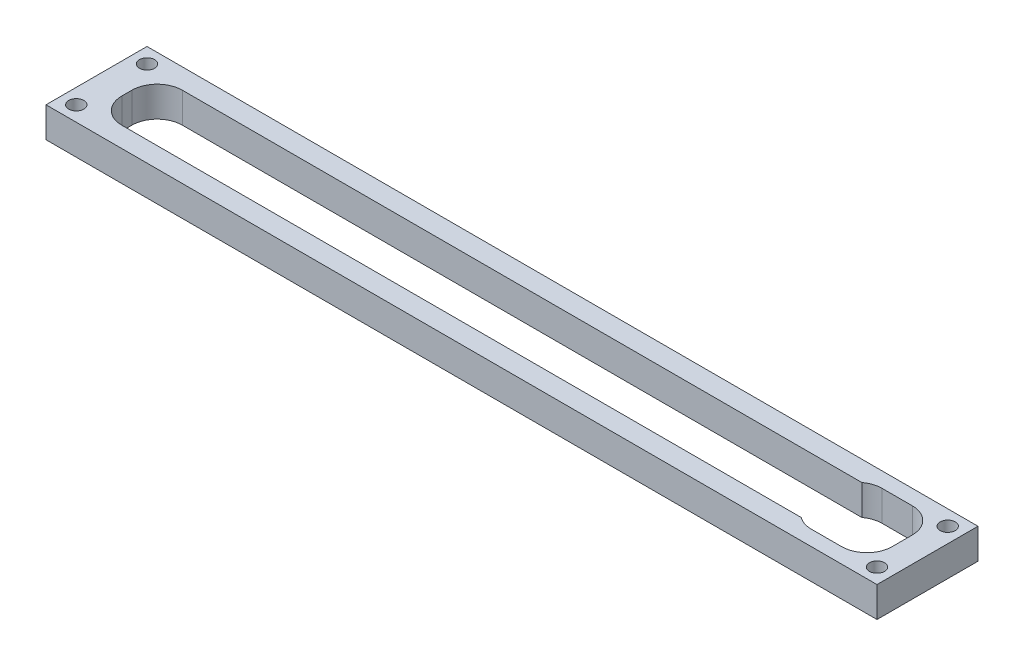
ISO-10303-21;
HEADER;
FILE_DESCRIPTION(('STEP AP214'),'2;1');
FILE_NAME('part.step','',(''),(''),'','','');
FILE_SCHEMA(('AUTOMOTIVE_DESIGN { 1 0 10303 214 1 1 1 1 }'));
ENDSEC;
DATA;
#1=APPLICATION_CONTEXT('core data for automotive mechanical design processes');
#2=APPLICATION_PROTOCOL_DEFINITION('international standard','automotive_design',2000,#1);
#3=PRODUCT_CONTEXT('',#1,'mechanical');
#4=PRODUCT('Part','Part','',(#3));
#5=PRODUCT_RELATED_PRODUCT_CATEGORY('part','',(#4));
#6=PRODUCT_DEFINITION_FORMATION('','',#4);
#7=PRODUCT_DEFINITION_CONTEXT('part definition',#1,'design');
#8=PRODUCT_DEFINITION('design','',#6,#7);
#9=PRODUCT_DEFINITION_SHAPE('','',#8);
#10=(LENGTH_UNIT() NAMED_UNIT(*) SI_UNIT(.MILLI.,.METRE.));
#11=(NAMED_UNIT(*) PLANE_ANGLE_UNIT() SI_UNIT($,.RADIAN.));
#12=(NAMED_UNIT(*) SI_UNIT($,.STERADIAN.) SOLID_ANGLE_UNIT());
#13=UNCERTAINTY_MEASURE_WITH_UNIT(LENGTH_MEASURE(1.E-05),#10,'distance_accuracy_value','');
#14=(GEOMETRIC_REPRESENTATION_CONTEXT(3) GLOBAL_UNCERTAINTY_ASSIGNED_CONTEXT((#13)) GLOBAL_UNIT_ASSIGNED_CONTEXT((#10,
#11,#12)) REPRESENTATION_CONTEXT('',''));
#15=CARTESIAN_POINT('',(0.,0.,0.));
#16=DIRECTION('',(0.,0.,1.));
#17=DIRECTION('',(1.,0.,0.));
#18=AXIS2_PLACEMENT_3D('',#15,#16,#17);
#19=CARTESIAN_POINT('',(0.,6.,0.));
#20=DIRECTION('',(0.,-1.,0.));
#21=DIRECTION('',(0.,0.,-1.));
#22=AXIS2_PLACEMENT_3D('',#19,#20,#21);
#23=PLANE('',#22);
#24=DIRECTION('',(0.,0.,1.));
#25=VECTOR('',#24,1.);
#26=CARTESIAN_POINT('',(0.,6.,0.));
#27=LINE('',#26,#25);
#28=CARTESIAN_POINT('',(0.,6.,-20.));
#29=VERTEX_POINT('',#28);
#30=CARTESIAN_POINT('',(0.,6.,0.));
#31=VERTEX_POINT('',#30);
#32=EDGE_CURVE('E250',#29,#31,#27,.T.);
#33=ORIENTED_EDGE('',*,*,#32,.T.);
#34=DIRECTION('',(1.,0.,0.));
#35=VECTOR('',#34,1.);
#36=CARTESIAN_POINT('',(0.,6.,0.));
#37=LINE('',#36,#35);
#38=CARTESIAN_POINT('',(164.534777256069,6.,0.));
#39=VERTEX_POINT('',#38);
#40=EDGE_CURVE('E253',#31,#39,#37,.T.);
#41=ORIENTED_EDGE('',*,*,#40,.T.);
#42=DIRECTION('',(0.,0.,-1.));
#43=VECTOR('',#42,1.);
#44=CARTESIAN_POINT('',(164.534777256069,6.,0.));
#45=LINE('',#44,#43);
#46=CARTESIAN_POINT('',(164.534777256069,6.,-20.));
#47=VERTEX_POINT('',#46);
#48=EDGE_CURVE('E256',#39,#47,#45,.T.);
#49=ORIENTED_EDGE('',*,*,#48,.T.);
#50=DIRECTION('',(-1.,0.,0.));
#51=VECTOR('',#50,1.);
#52=CARTESIAN_POINT('',(0.,6.,-20.));
#53=LINE('',#52,#51);
#54=EDGE_CURVE('E258',#47,#29,#53,.T.);
#55=ORIENTED_EDGE('',*,*,#54,.T.);
#56=EDGE_LOOP('',(#33,#41,#49,#55));
#57=FACE_BOUND('',#56,.T.);
#58=DIRECTION('',(-1.,0.,0.));
#59=VECTOR('',#58,1.);
#60=CARTESIAN_POINT('',(5.99999999999999,6.,-16.));
#61=LINE('',#60,#59);
#62=CARTESIAN_POINT('',(145.534777256069,6.,-16.));
#63=VERTEX_POINT('',#62);
#64=CARTESIAN_POINT('',(11.,6.,-16.));
#65=VERTEX_POINT('',#64);
#66=EDGE_CURVE('E243',#63,#65,#61,.T.);
#67=ORIENTED_EDGE('',*,*,#66,.F.);
#68=CARTESIAN_POINT('',(148.534777256069,6.,-12.));
#69=DIRECTION('',(0.,-1.,0.));
#70=DIRECTION('',(0.,0.,-1.));
#71=AXIS2_PLACEMENT_3D('',#68,#69,#70);
#72=CIRCLE('',#71,5.);
#73=CARTESIAN_POINT('',(148.534777256069,6.,-17.));
#74=VERTEX_POINT('',#73);
#75=EDGE_CURVE('E193',#63,#74,#72,.T.);
#76=ORIENTED_EDGE('',*,*,#75,.T.);
#77=DIRECTION('',(-1.,0.,0.));
#78=VECTOR('',#77,1.);
#79=CARTESIAN_POINT('',(145.534777256069,6.,-17.));
#80=LINE('',#79,#78);
#81=CARTESIAN_POINT('',(154.534777256069,6.,-17.));
#82=VERTEX_POINT('',#81);
#83=EDGE_CURVE('E205',#82,#74,#80,.T.);
#84=ORIENTED_EDGE('',*,*,#83,.F.);
#85=CARTESIAN_POINT('',(154.534777256069,6.,-12.));
#86=DIRECTION('',(0.,-1.,0.));
#87=DIRECTION('',(0.,0.,-1.));
#88=AXIS2_PLACEMENT_3D('',#85,#86,#87);
#89=CIRCLE('',#88,5.);
#90=CARTESIAN_POINT('',(159.534777256069,6.,-12.));
#91=VERTEX_POINT('',#90);
#92=EDGE_CURVE('E185',#82,#91,#89,.T.);
#93=ORIENTED_EDGE('',*,*,#92,.T.);
#94=DIRECTION('',(0.,0.,-1.));
#95=VECTOR('',#94,1.);
#96=CARTESIAN_POINT('',(159.534777256069,6.,-17.));
#97=LINE('',#96,#95);
#98=CARTESIAN_POINT('',(159.534777256069,6.,-8.00000000000001));
#99=VERTEX_POINT('',#98);
#100=EDGE_CURVE('E202',#99,#91,#97,.T.);
#101=ORIENTED_EDGE('',*,*,#100,.F.);
#102=CARTESIAN_POINT('',(154.534777256069,6.,-8.00000000000001));
#103=DIRECTION('',(0.,-1.,0.));
#104=DIRECTION('',(0.,0.,-1.));
#105=AXIS2_PLACEMENT_3D('',#102,#103,#104);
#106=CIRCLE('',#105,5.);
#107=CARTESIAN_POINT('',(154.534777256069,6.,-3.00000000000001));
#108=VERTEX_POINT('',#107);
#109=EDGE_CURVE('E189',#99,#108,#106,.T.);
#110=ORIENTED_EDGE('',*,*,#109,.T.);
#111=DIRECTION('',(1.,0.,0.));
#112=VECTOR('',#111,1.);
#113=CARTESIAN_POINT('',(145.534777256069,6.,-3.00000000000001));
#114=LINE('',#113,#112);
#115=CARTESIAN_POINT('',(148.534777256069,6.,-3.00000000000001));
#116=VERTEX_POINT('',#115);
#117=EDGE_CURVE('E200',#116,#108,#114,.T.);
#118=ORIENTED_EDGE('',*,*,#117,.F.);
#119=CARTESIAN_POINT('',(148.534777256069,6.,-8.00000000000001));
#120=DIRECTION('',(0.,-1.,0.));
#121=DIRECTION('',(0.,0.,-1.));
#122=AXIS2_PLACEMENT_3D('',#119,#120,#121);
#123=CIRCLE('',#122,5.);
#124=CARTESIAN_POINT('',(145.534777256069,6.,-4.00000000000002));
#125=VERTEX_POINT('',#124);
#126=EDGE_CURVE('E43',#116,#125,#123,.T.);
#127=ORIENTED_EDGE('',*,*,#126,.T.);
#128=DIRECTION('',(1.,0.,0.));
#129=VECTOR('',#128,1.);
#130=CARTESIAN_POINT('',(5.99999999999999,6.,-4.00000000000002));
#131=LINE('',#130,#129);
#132=CARTESIAN_POINT('',(11.,6.,-4.00000000000002));
#133=VERTEX_POINT('',#132);
#134=EDGE_CURVE('E162',#133,#125,#131,.T.);
#135=ORIENTED_EDGE('',*,*,#134,.F.);
#136=CARTESIAN_POINT('',(11.,6.,-9.00000000000001));
#137=DIRECTION('',(0.,-1.,0.));
#138=DIRECTION('',(0.,0.,-1.));
#139=AXIS2_PLACEMENT_3D('',#136,#137,#138);
#140=CIRCLE('',#139,5.);
#141=CARTESIAN_POINT('',(5.99999999999999,6.,-9.00000000000001));
#142=VERTEX_POINT('',#141);
#143=EDGE_CURVE('E179',#133,#142,#140,.T.);
#144=ORIENTED_EDGE('',*,*,#143,.T.);
#145=DIRECTION('',(0.,0.,1.));
#146=VECTOR('',#145,1.);
#147=CARTESIAN_POINT('',(5.99999999999999,6.,-16.));
#148=LINE('',#147,#146);
#149=CARTESIAN_POINT('',(5.99999999999999,6.,-11.));
#150=VERTEX_POINT('',#149);
#151=EDGE_CURVE('E239',#150,#142,#148,.T.);
#152=ORIENTED_EDGE('',*,*,#151,.F.);
#153=CARTESIAN_POINT('',(11.,6.,-11.));
#154=DIRECTION('',(0.,-1.,0.));
#155=DIRECTION('',(0.,0.,-1.));
#156=AXIS2_PLACEMENT_3D('',#153,#154,#155);
#157=CIRCLE('',#156,5.);
#158=EDGE_CURVE('E183',#150,#65,#157,.T.);
#159=ORIENTED_EDGE('',*,*,#158,.T.);
#160=EDGE_LOOP('',(#67,#76,#84,#93,#101,#110,#118,#127,#135,#144,#152,#159));
#161=FACE_BOUND('',#160,.T.);
#162=CARTESIAN_POINT('',(3.,6.,-17.));
#163=DIRECTION('',(0.,1.,0.));
#164=DIRECTION('',(0.,0.,1.));
#165=AXIS2_PLACEMENT_3D('',#162,#163,#164);
#166=CIRCLE('',#165,1.5);
#167=CARTESIAN_POINT('',(3.,6.,-15.5));
#168=VERTEX_POINT('',#167);
#169=EDGE_CURVE('E234',#168,#168,#166,.T.);
#170=ORIENTED_EDGE('',*,*,#169,.F.);
#171=EDGE_LOOP('',(#170));
#172=FACE_BOUND('',#171,.T.);
#173=CARTESIAN_POINT('',(3.,6.,-3.));
#174=DIRECTION('',(0.,1.,0.));
#175=DIRECTION('',(0.,0.,-1.));
#176=AXIS2_PLACEMENT_3D('',#173,#174,#175);
#177=CIRCLE('',#176,1.5);
#178=CARTESIAN_POINT('',(3.,6.,-4.5));
#179=VERTEX_POINT('',#178);
#180=EDGE_CURVE('E228',#179,#179,#177,.T.);
#181=ORIENTED_EDGE('',*,*,#180,.F.);
#182=EDGE_LOOP('',(#181));
#183=FACE_BOUND('',#182,.T.);
#184=CARTESIAN_POINT('',(161.534777256069,6.,-3.00000000000002));
#185=DIRECTION('',(0.,1.,0.));
#186=DIRECTION('',(0.,0.,1.));
#187=AXIS2_PLACEMENT_3D('',#184,#185,#186);
#188=CIRCLE('',#187,1.5);
#189=CARTESIAN_POINT('',(161.534777256069,6.,-1.50000000000002));
#190=VERTEX_POINT('',#189);
#191=EDGE_CURVE('E222',#190,#190,#188,.T.);
#192=ORIENTED_EDGE('',*,*,#191,.F.);
#193=EDGE_LOOP('',(#192));
#194=FACE_BOUND('',#193,.T.);
#195=CARTESIAN_POINT('',(161.534777256069,6.,-17.0000000000001));
#196=DIRECTION('',(0.,1.,0.));
#197=DIRECTION('',(0.,0.,-1.));
#198=AXIS2_PLACEMENT_3D('',#195,#196,#197);
#199=CIRCLE('',#198,1.5);
#200=CARTESIAN_POINT('',(161.534777256069,6.,-18.5000000000001));
#201=VERTEX_POINT('',#200);
#202=EDGE_CURVE('E216',#201,#201,#199,.T.);
#203=ORIENTED_EDGE('',*,*,#202,.F.);
#204=EDGE_LOOP('',(#203));
#205=FACE_BOUND('',#204,.T.);
#206=ADVANCED_FACE('F35',(#57,#161,#172,#183,#194,#205),#23,.F.);
#207=CARTESIAN_POINT('',(0.,0.,0.));
#208=DIRECTION('',(0.,-1.,0.));
#209=DIRECTION('',(0.,0.,-1.));
#210=AXIS2_PLACEMENT_3D('',#207,#208,#209);
#211=PLANE('',#210);
#212=DIRECTION('',(-1.,0.,0.));
#213=VECTOR('',#212,1.);
#214=CARTESIAN_POINT('',(145.534777256069,0.,-17.));
#215=LINE('',#214,#213);
#216=CARTESIAN_POINT('',(154.534777256069,0.,-17.));
#217=VERTEX_POINT('',#216);
#218=CARTESIAN_POINT('',(148.534777256069,0.,-17.));
#219=VERTEX_POINT('',#218);
#220=EDGE_CURVE('E165',#217,#219,#215,.T.);
#221=ORIENTED_EDGE('',*,*,#220,.T.);
#222=CARTESIAN_POINT('',(148.534777256069,0.,-12.));
#223=DIRECTION('',(0.,-1.,0.));
#224=DIRECTION('',(0.,0.,-1.));
#225=AXIS2_PLACEMENT_3D('',#222,#223,#224);
#226=CIRCLE('',#225,5.);
#227=CARTESIAN_POINT('',(145.534777256069,0.,-16.));
#228=VERTEX_POINT('',#227);
#229=EDGE_CURVE('E195',#219,#228,#226,.F.);
#230=ORIENTED_EDGE('',*,*,#229,.T.);
#231=DIRECTION('',(-1.,0.,0.));
#232=VECTOR('',#231,1.);
#233=CARTESIAN_POINT('',(5.99999999999999,0.,-16.));
#234=LINE('',#233,#232);
#235=CARTESIAN_POINT('',(11.,0.,-16.));
#236=VERTEX_POINT('',#235);
#237=EDGE_CURVE('E154',#228,#236,#234,.T.);
#238=ORIENTED_EDGE('',*,*,#237,.T.);
#239=CARTESIAN_POINT('',(11.,0.,-11.));
#240=DIRECTION('',(0.,-1.,0.));
#241=DIRECTION('',(0.,0.,-1.));
#242=AXIS2_PLACEMENT_3D('',#239,#240,#241);
#243=CIRCLE('',#242,5.);
#244=CARTESIAN_POINT('',(5.99999999999999,0.,-11.));
#245=VERTEX_POINT('',#244);
#246=EDGE_CURVE('E181',#236,#245,#243,.F.);
#247=ORIENTED_EDGE('',*,*,#246,.T.);
#248=DIRECTION('',(0.,0.,1.));
#249=VECTOR('',#248,1.);
#250=CARTESIAN_POINT('',(5.99999999999999,0.,-16.));
#251=LINE('',#250,#249);
#252=CARTESIAN_POINT('',(5.99999999999999,0.,-9.00000000000001));
#253=VERTEX_POINT('',#252);
#254=EDGE_CURVE('E155',#245,#253,#251,.T.);
#255=ORIENTED_EDGE('',*,*,#254,.T.);
#256=CARTESIAN_POINT('',(11.,0.,-9.00000000000001));
#257=DIRECTION('',(0.,-1.,0.));
#258=DIRECTION('',(0.,0.,-1.));
#259=AXIS2_PLACEMENT_3D('',#256,#257,#258);
#260=CIRCLE('',#259,5.);
#261=CARTESIAN_POINT('',(11.,0.,-4.00000000000002));
#262=VERTEX_POINT('',#261);
#263=EDGE_CURVE('E151',#253,#262,#260,.F.);
#264=ORIENTED_EDGE('',*,*,#263,.T.);
#265=DIRECTION('',(1.,0.,0.));
#266=VECTOR('',#265,1.);
#267=CARTESIAN_POINT('',(5.99999999999999,0.,-4.00000000000002));
#268=LINE('',#267,#266);
#269=CARTESIAN_POINT('',(145.534777256069,0.,-4.00000000000002));
#270=VERTEX_POINT('',#269);
#271=EDGE_CURVE('E145',#262,#270,#268,.T.);
#272=ORIENTED_EDGE('',*,*,#271,.T.);
#273=CARTESIAN_POINT('',(148.534777256069,0.,-8.00000000000001));
#274=DIRECTION('',(0.,-1.,0.));
#275=DIRECTION('',(0.,0.,-1.));
#276=AXIS2_PLACEMENT_3D('',#273,#274,#275);
#277=CIRCLE('',#276,5.);
#278=CARTESIAN_POINT('',(148.534777256069,0.,-3.00000000000001));
#279=VERTEX_POINT('',#278);
#280=EDGE_CURVE('E11',#270,#279,#277,.F.);
#281=ORIENTED_EDGE('',*,*,#280,.T.);
#282=DIRECTION('',(1.,0.,0.));
#283=VECTOR('',#282,1.);
#284=CARTESIAN_POINT('',(145.534777256069,0.,-3.00000000000001));
#285=LINE('',#284,#283);
#286=CARTESIAN_POINT('',(154.534777256069,0.,-3.00000000000001));
#287=VERTEX_POINT('',#286);
#288=EDGE_CURVE('E212',#279,#287,#285,.T.);
#289=ORIENTED_EDGE('',*,*,#288,.T.);
#290=CARTESIAN_POINT('',(154.534777256069,0.,-8.00000000000001));
#291=DIRECTION('',(0.,-1.,0.));
#292=DIRECTION('',(0.,0.,-1.));
#293=AXIS2_PLACEMENT_3D('',#290,#291,#292);
#294=CIRCLE('',#293,5.);
#295=CARTESIAN_POINT('',(159.534777256069,0.,-8.00000000000001));
#296=VERTEX_POINT('',#295);
#297=EDGE_CURVE('E191',#287,#296,#294,.F.);
#298=ORIENTED_EDGE('',*,*,#297,.T.);
#299=DIRECTION('',(0.,0.,-1.));
#300=VECTOR('',#299,1.);
#301=CARTESIAN_POINT('',(159.534777256069,0.,-17.));
#302=LINE('',#301,#300);
#303=CARTESIAN_POINT('',(159.534777256069,0.,-12.));
#304=VERTEX_POINT('',#303);
#305=EDGE_CURVE('E300',#296,#304,#302,.T.);
#306=ORIENTED_EDGE('',*,*,#305,.T.);
#307=CARTESIAN_POINT('',(154.534777256069,0.,-12.));
#308=DIRECTION('',(0.,-1.,0.));
#309=DIRECTION('',(0.,0.,-1.));
#310=AXIS2_PLACEMENT_3D('',#307,#308,#309);
#311=CIRCLE('',#310,5.);
#312=EDGE_CURVE('E187',#304,#217,#311,.F.);
#313=ORIENTED_EDGE('',*,*,#312,.T.);
#314=EDGE_LOOP('',(#221,#230,#238,#247,#255,#264,#272,#281,#289,#298,#306,#313));
#315=FACE_BOUND('',#314,.T.);
#316=CARTESIAN_POINT('',(161.534777256069,0.,-3.00000000000002));
#317=DIRECTION('',(0.,1.,0.));
#318=DIRECTION('',(0.,0.,1.));
#319=AXIS2_PLACEMENT_3D('',#316,#317,#318);
#320=CIRCLE('',#319,1.5);
#321=CARTESIAN_POINT('',(161.534777256069,0.,-1.50000000000002));
#322=VERTEX_POINT('',#321);
#323=EDGE_CURVE('E219',#322,#322,#320,.T.);
#324=ORIENTED_EDGE('',*,*,#323,.T.);
#325=EDGE_LOOP('',(#324));
#326=FACE_BOUND('',#325,.T.);
#327=CARTESIAN_POINT('',(3.,0.,-17.));
#328=DIRECTION('',(0.,1.,0.));
#329=DIRECTION('',(0.,0.,1.));
#330=AXIS2_PLACEMENT_3D('',#327,#328,#329);
#331=CIRCLE('',#330,1.5);
#332=CARTESIAN_POINT('',(3.,0.,-15.5));
#333=VERTEX_POINT('',#332);
#334=EDGE_CURVE('E231',#333,#333,#331,.T.);
#335=ORIENTED_EDGE('',*,*,#334,.T.);
#336=EDGE_LOOP('',(#335));
#337=FACE_BOUND('',#336,.T.);
#338=DIRECTION('',(0.,0.,1.));
#339=VECTOR('',#338,1.);
#340=CARTESIAN_POINT('',(0.,0.,0.));
#341=LINE('',#340,#339);
#342=CARTESIAN_POINT('',(0.,0.,-20.));
#343=VERTEX_POINT('',#342);
#344=CARTESIAN_POINT('',(0.,0.,0.));
#345=VERTEX_POINT('',#344);
#346=EDGE_CURVE('E246',#343,#345,#341,.T.);
#347=ORIENTED_EDGE('',*,*,#346,.F.);
#348=DIRECTION('',(-1.,0.,0.));
#349=VECTOR('',#348,1.);
#350=CARTESIAN_POINT('',(0.,0.,-20.));
#351=LINE('',#350,#349);
#352=CARTESIAN_POINT('',(164.534777256069,0.,-20.));
#353=VERTEX_POINT('',#352);
#354=EDGE_CURVE('E254',#353,#343,#351,.T.);
#355=ORIENTED_EDGE('',*,*,#354,.F.);
#356=DIRECTION('',(0.,0.,-1.));
#357=VECTOR('',#356,1.);
#358=CARTESIAN_POINT('',(164.534777256069,0.,0.));
#359=LINE('',#358,#357);
#360=CARTESIAN_POINT('',(164.534777256069,0.,0.));
#361=VERTEX_POINT('',#360);
#362=EDGE_CURVE('E265',#361,#353,#359,.T.);
#363=ORIENTED_EDGE('',*,*,#362,.F.);
#364=DIRECTION('',(1.,0.,0.));
#365=VECTOR('',#364,1.);
#366=CARTESIAN_POINT('',(0.,0.,0.));
#367=LINE('',#366,#365);
#368=EDGE_CURVE('E263',#345,#361,#367,.T.);
#369=ORIENTED_EDGE('',*,*,#368,.F.);
#370=EDGE_LOOP('',(#347,#355,#363,#369));
#371=FACE_BOUND('',#370,.T.);
#372=CARTESIAN_POINT('',(3.,0.,-3.));
#373=DIRECTION('',(0.,1.,0.));
#374=DIRECTION('',(0.,0.,-1.));
#375=AXIS2_PLACEMENT_3D('',#372,#373,#374);
#376=CIRCLE('',#375,1.5);
#377=CARTESIAN_POINT('',(3.,0.,-4.5));
#378=VERTEX_POINT('',#377);
#379=EDGE_CURVE('E225',#378,#378,#376,.T.);
#380=ORIENTED_EDGE('',*,*,#379,.T.);
#381=EDGE_LOOP('',(#380));
#382=FACE_BOUND('',#381,.T.);
#383=CARTESIAN_POINT('',(161.534777256069,0.,-17.0000000000001));
#384=DIRECTION('',(0.,1.,0.));
#385=DIRECTION('',(0.,0.,-1.));
#386=AXIS2_PLACEMENT_3D('',#383,#384,#385);
#387=CIRCLE('',#386,1.5);
#388=CARTESIAN_POINT('',(161.534777256069,0.,-18.5000000000001));
#389=VERTEX_POINT('',#388);
#390=EDGE_CURVE('E214',#389,#389,#387,.T.);
#391=ORIENTED_EDGE('',*,*,#390,.T.);
#392=EDGE_LOOP('',(#391));
#393=FACE_BOUND('',#392,.T.);
#394=ADVANCED_FACE('F148',(#315,#326,#337,#371,#382,#393),#211,.T.);
#395=CARTESIAN_POINT('',(0.,6.,0.));
#396=DIRECTION('',(1.,0.,0.));
#397=DIRECTION('',(0.,0.,-1.));
#398=AXIS2_PLACEMENT_3D('',#395,#396,#397);
#399=PLANE('',#398);
#400=ORIENTED_EDGE('',*,*,#346,.T.);
#401=DIRECTION('',(0.,-1.,0.));
#402=VECTOR('',#401,1.);
#403=CARTESIAN_POINT('',(0.,6.,0.));
#404=LINE('',#403,#402);
#405=EDGE_CURVE('E276',#31,#345,#404,.T.);
#406=ORIENTED_EDGE('',*,*,#405,.F.);
#407=ORIENTED_EDGE('',*,*,#32,.F.);
#408=DIRECTION('',(0.,-1.,0.));
#409=VECTOR('',#408,1.);
#410=CARTESIAN_POINT('',(0.,6.,-20.));
#411=LINE('',#410,#409);
#412=EDGE_CURVE('E260',#29,#343,#411,.T.);
#413=ORIENTED_EDGE('',*,*,#412,.T.);
#414=EDGE_LOOP('',(#400,#406,#407,#413));
#415=FACE_BOUND('',#414,.T.);
#416=ADVANCED_FACE('F331',(#415),#399,.F.);
#417=CARTESIAN_POINT('',(0.,6.,0.));
#418=DIRECTION('',(0.,0.,-1.));
#419=DIRECTION('',(-1.,0.,0.));
#420=AXIS2_PLACEMENT_3D('',#417,#418,#419);
#421=PLANE('',#420);
#422=ORIENTED_EDGE('',*,*,#368,.T.);
#423=DIRECTION('',(0.,-1.,0.));
#424=VECTOR('',#423,1.);
#425=CARTESIAN_POINT('',(164.534777256069,6.,0.));
#426=LINE('',#425,#424);
#427=EDGE_CURVE('E273',#39,#361,#426,.T.);
#428=ORIENTED_EDGE('',*,*,#427,.F.);
#429=ORIENTED_EDGE('',*,*,#40,.F.);
#430=ORIENTED_EDGE('',*,*,#405,.T.);
#431=EDGE_LOOP('',(#422,#428,#429,#430));
#432=FACE_BOUND('',#431,.T.);
#433=ADVANCED_FACE('F344',(#432),#421,.F.);
#434=CARTESIAN_POINT('',(164.534777256069,6.,0.));
#435=DIRECTION('',(-1.,0.,0.));
#436=DIRECTION('',(0.,0.,1.));
#437=AXIS2_PLACEMENT_3D('',#434,#435,#436);
#438=PLANE('',#437);
#439=ORIENTED_EDGE('',*,*,#362,.T.);
#440=DIRECTION('',(0.,-1.,0.));
#441=VECTOR('',#440,1.);
#442=CARTESIAN_POINT('',(164.534777256069,6.,-20.));
#443=LINE('',#442,#441);
#444=EDGE_CURVE('E270',#47,#353,#443,.T.);
#445=ORIENTED_EDGE('',*,*,#444,.F.);
#446=ORIENTED_EDGE('',*,*,#48,.F.);
#447=ORIENTED_EDGE('',*,*,#427,.T.);
#448=EDGE_LOOP('',(#439,#445,#446,#447));
#449=FACE_BOUND('',#448,.T.);
#450=ADVANCED_FACE('F340',(#449),#438,.F.);
#451=CARTESIAN_POINT('',(0.,6.,-20.));
#452=DIRECTION('',(0.,0.,1.));
#453=DIRECTION('',(1.,0.,0.));
#454=AXIS2_PLACEMENT_3D('',#451,#452,#453);
#455=PLANE('',#454);
#456=ORIENTED_EDGE('',*,*,#354,.T.);
#457=ORIENTED_EDGE('',*,*,#412,.F.);
#458=ORIENTED_EDGE('',*,*,#54,.F.);
#459=ORIENTED_EDGE('',*,*,#444,.T.);
#460=EDGE_LOOP('',(#456,#457,#458,#459));
#461=FACE_BOUND('',#460,.T.);
#462=ADVANCED_FACE('F337',(#461),#455,.F.);
#463=CARTESIAN_POINT('',(5.99999999999999,6.,-16.));
#464=DIRECTION('',(1.,0.,0.));
#465=DIRECTION('',(0.,0.,-1.));
#466=AXIS2_PLACEMENT_3D('',#463,#464,#465);
#467=PLANE('',#466);
#468=ORIENTED_EDGE('',*,*,#151,.T.);
#469=DIRECTION('',(0.,-1.,0.));
#470=VECTOR('',#469,1.);
#471=CARTESIAN_POINT('',(5.99999999999999,0.,-9.00000000000001));
#472=LINE('',#471,#470);
#473=EDGE_CURVE('E281',#142,#253,#472,.T.);
#474=ORIENTED_EDGE('',*,*,#473,.T.);
#475=ORIENTED_EDGE('',*,*,#254,.F.);
#476=DIRECTION('',(0.,-1.,0.));
#477=VECTOR('',#476,1.);
#478=CARTESIAN_POINT('',(5.99999999999999,6.,-11.));
#479=LINE('',#478,#477);
#480=EDGE_CURVE('E279',#245,#150,#479,.F.);
#481=ORIENTED_EDGE('',*,*,#480,.T.);
#482=EDGE_LOOP('',(#468,#474,#475,#481));
#483=FACE_BOUND('',#482,.T.);
#484=ADVANCED_FACE('F334',(#483),#467,.T.);
#485=CARTESIAN_POINT('',(5.99999999999999,6.,-4.00000000000002));
#486=DIRECTION('',(0.,0.,-1.));
#487=DIRECTION('',(-1.,0.,0.));
#488=AXIS2_PLACEMENT_3D('',#485,#486,#487);
#489=PLANE('',#488);
#490=ORIENTED_EDGE('',*,*,#271,.F.);
#491=DIRECTION('',(0.,-1.,0.));
#492=VECTOR('',#491,1.);
#493=CARTESIAN_POINT('',(11.,6.,-4.00000000000002));
#494=LINE('',#493,#492);
#495=EDGE_CURVE('E284',#262,#133,#494,.F.);
#496=ORIENTED_EDGE('',*,*,#495,.T.);
#497=ORIENTED_EDGE('',*,*,#134,.T.);
#498=DIRECTION('',(0.,1.,0.));
#499=VECTOR('',#498,1.);
#500=CARTESIAN_POINT('',(145.534777256069,0.,-4.00000000000002));
#501=LINE('',#500,#499);
#502=EDGE_CURVE('E159',#270,#125,#501,.T.);
#503=ORIENTED_EDGE('',*,*,#502,.F.);
#504=EDGE_LOOP('',(#490,#496,#497,#503));
#505=FACE_BOUND('',#504,.T.);
#506=ADVANCED_FACE('F160',(#505),#489,.T.);
#507=CARTESIAN_POINT('',(5.99999999999999,6.,-16.));
#508=DIRECTION('',(0.,0.,1.));
#509=DIRECTION('',(1.,0.,0.));
#510=AXIS2_PLACEMENT_3D('',#507,#508,#509);
#511=PLANE('',#510);
#512=ORIENTED_EDGE('',*,*,#66,.T.);
#513=DIRECTION('',(0.,-1.,0.));
#514=VECTOR('',#513,1.);
#515=CARTESIAN_POINT('',(11.,0.,-16.));
#516=LINE('',#515,#514);
#517=EDGE_CURVE('E286',#65,#236,#516,.T.);
#518=ORIENTED_EDGE('',*,*,#517,.T.);
#519=ORIENTED_EDGE('',*,*,#237,.F.);
#520=DIRECTION('',(0.,1.,0.));
#521=VECTOR('',#520,1.);
#522=CARTESIAN_POINT('',(145.534777256069,0.,-16.));
#523=LINE('',#522,#521);
#524=EDGE_CURVE('E164',#228,#63,#523,.T.);
#525=ORIENTED_EDGE('',*,*,#524,.T.);
#526=EDGE_LOOP('',(#512,#518,#519,#525));
#527=FACE_BOUND('',#526,.T.);
#528=ADVANCED_FACE('F366',(#527),#511,.T.);
#529=CARTESIAN_POINT('',(3.,6.,-17.));
#530=DIRECTION('',(0.,-1.,0.));
#531=DIRECTION('',(0.,0.,-1.));
#532=AXIS2_PLACEMENT_3D('',#529,#530,#531);
#533=CYLINDRICAL_SURFACE('',#532,1.5);
#534=ORIENTED_EDGE('',*,*,#169,.T.);
#535=EDGE_LOOP('',(#534));
#536=FACE_BOUND('',#535,.T.);
#537=ORIENTED_EDGE('',*,*,#334,.F.);
#538=EDGE_LOOP('',(#537));
#539=FACE_BOUND('',#538,.T.);
#540=ADVANCED_FACE('F379',(#536,#539),#533,.F.);
#541=CARTESIAN_POINT('',(3.,6.,-3.));
#542=DIRECTION('',(0.,-1.,0.));
#543=DIRECTION('',(0.,0.,-1.));
#544=AXIS2_PLACEMENT_3D('',#541,#542,#543);
#545=CYLINDRICAL_SURFACE('',#544,1.5);
#546=ORIENTED_EDGE('',*,*,#180,.T.);
#547=EDGE_LOOP('',(#546));
#548=FACE_BOUND('',#547,.T.);
#549=ORIENTED_EDGE('',*,*,#379,.F.);
#550=EDGE_LOOP('',(#549));
#551=FACE_BOUND('',#550,.T.);
#552=ADVANCED_FACE('F384',(#548,#551),#545,.F.);
#553=CARTESIAN_POINT('',(161.534777256069,6.,-3.00000000000002));
#554=DIRECTION('',(0.,-1.,0.));
#555=DIRECTION('',(0.,0.,-1.));
#556=AXIS2_PLACEMENT_3D('',#553,#554,#555);
#557=CYLINDRICAL_SURFACE('',#556,1.5);
#558=ORIENTED_EDGE('',*,*,#191,.T.);
#559=EDGE_LOOP('',(#558));
#560=FACE_BOUND('',#559,.T.);
#561=ORIENTED_EDGE('',*,*,#323,.F.);
#562=EDGE_LOOP('',(#561));
#563=FACE_BOUND('',#562,.T.);
#564=ADVANCED_FACE('F388',(#560,#563),#557,.F.);
#565=CARTESIAN_POINT('',(161.534777256069,6.,-17.0000000000001));
#566=DIRECTION('',(0.,-1.,0.));
#567=DIRECTION('',(0.,0.,-1.));
#568=AXIS2_PLACEMENT_3D('',#565,#566,#567);
#569=CYLINDRICAL_SURFACE('',#568,1.5);
#570=ORIENTED_EDGE('',*,*,#202,.T.);
#571=EDGE_LOOP('',(#570));
#572=FACE_BOUND('',#571,.T.);
#573=ORIENTED_EDGE('',*,*,#390,.F.);
#574=EDGE_LOOP('',(#573));
#575=FACE_BOUND('',#574,.T.);
#576=ADVANCED_FACE('F392',(#572,#575),#569,.F.);
#577=CARTESIAN_POINT('',(145.534777256069,0.,-17.));
#578=DIRECTION('',(0.,0.,-1.));
#579=DIRECTION('',(-1.,0.,0.));
#580=AXIS2_PLACEMENT_3D('',#577,#578,#579);
#581=PLANE('',#580);
#582=ORIENTED_EDGE('',*,*,#220,.F.);
#583=DIRECTION('',(0.,1.,0.));
#584=VECTOR('',#583,1.);
#585=CARTESIAN_POINT('',(154.534777256069,6.,-17.));
#586=LINE('',#585,#584);
#587=EDGE_CURVE('E291',#217,#82,#586,.T.);
#588=ORIENTED_EDGE('',*,*,#587,.T.);
#589=ORIENTED_EDGE('',*,*,#83,.T.);
#590=DIRECTION('',(0.,1.,0.));
#591=VECTOR('',#590,1.);
#592=CARTESIAN_POINT('',(148.534777256069,0.,-17.));
#593=LINE('',#592,#591);
#594=EDGE_CURVE('E289',#74,#219,#593,.F.);
#595=ORIENTED_EDGE('',*,*,#594,.T.);
#596=EDGE_LOOP('',(#582,#588,#589,#595));
#597=FACE_BOUND('',#596,.T.);
#598=ADVANCED_FACE('F310',(#597),#581,.F.);
#599=CARTESIAN_POINT('',(159.534777256069,0.,-17.));
#600=DIRECTION('',(1.,0.,0.));
#601=DIRECTION('',(0.,0.,-1.));
#602=AXIS2_PLACEMENT_3D('',#599,#600,#601);
#603=PLANE('',#602);
#604=ORIENTED_EDGE('',*,*,#100,.T.);
#605=DIRECTION('',(0.,1.,0.));
#606=VECTOR('',#605,1.);
#607=CARTESIAN_POINT('',(159.534777256069,0.,-12.));
#608=LINE('',#607,#606);
#609=EDGE_CURVE('E171',#91,#304,#608,.F.);
#610=ORIENTED_EDGE('',*,*,#609,.T.);
#611=ORIENTED_EDGE('',*,*,#305,.F.);
#612=DIRECTION('',(0.,1.,0.));
#613=VECTOR('',#612,1.);
#614=CARTESIAN_POINT('',(159.534777256069,6.,-8.00000000000001));
#615=LINE('',#614,#613);
#616=EDGE_CURVE('E174',#296,#99,#615,.T.);
#617=ORIENTED_EDGE('',*,*,#616,.T.);
#618=EDGE_LOOP('',(#604,#610,#611,#617));
#619=FACE_BOUND('',#618,.T.);
#620=ADVANCED_FACE('F297',(#619),#603,.F.);
#621=CARTESIAN_POINT('',(145.534777256069,0.,-3.00000000000001));
#622=DIRECTION('',(0.,0.,1.));
#623=DIRECTION('',(1.,0.,0.));
#624=AXIS2_PLACEMENT_3D('',#621,#622,#623);
#625=PLANE('',#624);
#626=ORIENTED_EDGE('',*,*,#117,.T.);
#627=DIRECTION('',(0.,1.,0.));
#628=VECTOR('',#627,1.);
#629=CARTESIAN_POINT('',(154.534777256069,0.,-3.00000000000001));
#630=LINE('',#629,#628);
#631=EDGE_CURVE('E50',#108,#287,#630,.F.);
#632=ORIENTED_EDGE('',*,*,#631,.T.);
#633=ORIENTED_EDGE('',*,*,#288,.F.);
#634=DIRECTION('',(0.,-1.,0.));
#635=VECTOR('',#634,1.);
#636=CARTESIAN_POINT('',(148.534777256069,0.,-3.00000000000001));
#637=LINE('',#636,#635);
#638=EDGE_CURVE('E169',#279,#116,#637,.F.);
#639=ORIENTED_EDGE('',*,*,#638,.T.);
#640=EDGE_LOOP('',(#626,#632,#633,#639));
#641=FACE_BOUND('',#640,.T.);
#642=ADVANCED_FACE('F355',(#641),#625,.F.);
#643=CARTESIAN_POINT('',(11.,6.,-9.00000000000001));
#644=DIRECTION('',(0.,1.,0.));
#645=DIRECTION('',(0.,0.,1.));
#646=AXIS2_PLACEMENT_3D('',#643,#644,#645);
#647=CYLINDRICAL_SURFACE('',#646,5.);
#648=ORIENTED_EDGE('',*,*,#143,.F.);
#649=ORIENTED_EDGE('',*,*,#495,.F.);
#650=ORIENTED_EDGE('',*,*,#263,.F.);
#651=ORIENTED_EDGE('',*,*,#473,.F.);
#652=EDGE_LOOP('',(#648,#649,#650,#651));
#653=FACE_BOUND('',#652,.T.);
#654=ADVANCED_FACE('F352',(#653),#647,.F.);
#655=CARTESIAN_POINT('',(11.,6.,-11.));
#656=DIRECTION('',(0.,1.,0.));
#657=DIRECTION('',(0.,0.,1.));
#658=AXIS2_PLACEMENT_3D('',#655,#656,#657);
#659=CYLINDRICAL_SURFACE('',#658,5.);
#660=ORIENTED_EDGE('',*,*,#158,.F.);
#661=ORIENTED_EDGE('',*,*,#480,.F.);
#662=ORIENTED_EDGE('',*,*,#246,.F.);
#663=ORIENTED_EDGE('',*,*,#517,.F.);
#664=EDGE_LOOP('',(#660,#661,#662,#663));
#665=FACE_BOUND('',#664,.T.);
#666=ADVANCED_FACE('F323',(#665),#659,.F.);
#667=CARTESIAN_POINT('',(154.534777256069,0.,-12.));
#668=DIRECTION('',(0.,-1.,0.));
#669=DIRECTION('',(0.,0.,-1.));
#670=AXIS2_PLACEMENT_3D('',#667,#668,#669);
#671=CYLINDRICAL_SURFACE('',#670,5.);
#672=ORIENTED_EDGE('',*,*,#312,.F.);
#673=ORIENTED_EDGE('',*,*,#609,.F.);
#674=ORIENTED_EDGE('',*,*,#92,.F.);
#675=ORIENTED_EDGE('',*,*,#587,.F.);
#676=EDGE_LOOP('',(#672,#673,#674,#675));
#677=FACE_BOUND('',#676,.T.);
#678=ADVANCED_FACE('F307',(#677),#671,.F.);
#679=CARTESIAN_POINT('',(154.534777256069,0.,-8.00000000000001));
#680=DIRECTION('',(0.,-1.,0.));
#681=DIRECTION('',(0.,0.,-1.));
#682=AXIS2_PLACEMENT_3D('',#679,#680,#681);
#683=CYLINDRICAL_SURFACE('',#682,5.);
#684=ORIENTED_EDGE('',*,*,#297,.F.);
#685=ORIENTED_EDGE('',*,*,#631,.F.);
#686=ORIENTED_EDGE('',*,*,#109,.F.);
#687=ORIENTED_EDGE('',*,*,#616,.F.);
#688=EDGE_LOOP('',(#684,#685,#686,#687));
#689=FACE_BOUND('',#688,.T.);
#690=ADVANCED_FACE('F314',(#689),#683,.F.);
#691=CARTESIAN_POINT('',(148.534777256069,0.,-12.));
#692=DIRECTION('',(0.,1.,0.));
#693=DIRECTION('',(0.,0.,1.));
#694=AXIS2_PLACEMENT_3D('',#691,#692,#693);
#695=CYLINDRICAL_SURFACE('',#694,5.);
#696=ORIENTED_EDGE('',*,*,#229,.F.);
#697=ORIENTED_EDGE('',*,*,#594,.F.);
#698=ORIENTED_EDGE('',*,*,#75,.F.);
#699=ORIENTED_EDGE('',*,*,#524,.F.);
#700=EDGE_LOOP('',(#696,#697,#698,#699));
#701=FACE_BOUND('',#700,.T.);
#702=ADVANCED_FACE('F316',(#701),#695,.F.);
#703=CARTESIAN_POINT('',(148.534777256069,0.,-8.00000000000001));
#704=DIRECTION('',(0.,-1.,0.));
#705=DIRECTION('',(0.,0.,-1.));
#706=AXIS2_PLACEMENT_3D('',#703,#704,#705);
#707=CYLINDRICAL_SURFACE('',#706,5.);
#708=ORIENTED_EDGE('',*,*,#280,.F.);
#709=ORIENTED_EDGE('',*,*,#502,.T.);
#710=ORIENTED_EDGE('',*,*,#126,.F.);
#711=ORIENTED_EDGE('',*,*,#638,.F.);
#712=EDGE_LOOP('',(#708,#709,#710,#711));
#713=FACE_BOUND('',#712,.T.);
#714=ADVANCED_FACE('F37',(#713),#707,.F.);
#715=CLOSED_SHELL('',(#206,#394,#416,#433,#450,#462,#484,#506,#528,#540,#552,#564,#576,#598,
#620,#642,#654,#666,#678,#690,#702,#714));
#716=MANIFOLD_SOLID_BREP('B2',#715);
#717=ADVANCED_BREP_SHAPE_REPRESENTATION('',(#18,#716),#14);
#718=SHAPE_DEFINITION_REPRESENTATION(#9,#717);
ENDSEC;
END-ISO-10303-21;
